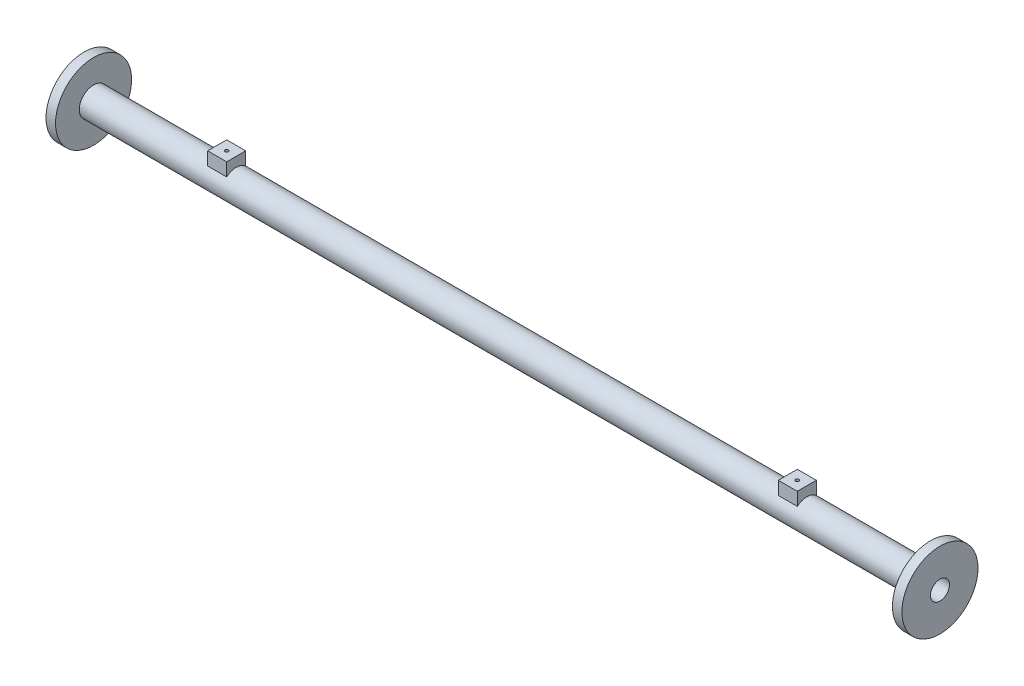
ISO-10303-21;
HEADER;
FILE_DESCRIPTION(('STEP AP214'),'2;1');
FILE_NAME('part.step','',(''),(''),'','','');
FILE_SCHEMA(('AUTOMOTIVE_DESIGN { 1 0 10303 214 1 1 1 1 }'));
ENDSEC;
DATA;
#1=APPLICATION_CONTEXT('core data for automotive mechanical design processes');
#2=APPLICATION_PROTOCOL_DEFINITION('international standard','automotive_design',2000,#1);
#3=PRODUCT_CONTEXT('',#1,'mechanical');
#4=PRODUCT('Part','Part','',(#3));
#5=PRODUCT_RELATED_PRODUCT_CATEGORY('part','',(#4));
#6=PRODUCT_DEFINITION_FORMATION('','',#4);
#7=PRODUCT_DEFINITION_CONTEXT('part definition',#1,'design');
#8=PRODUCT_DEFINITION('design','',#6,#7);
#9=PRODUCT_DEFINITION_SHAPE('','',#8);
#10=(LENGTH_UNIT() NAMED_UNIT(*) SI_UNIT(.MILLI.,.METRE.));
#11=(NAMED_UNIT(*) PLANE_ANGLE_UNIT() SI_UNIT($,.RADIAN.));
#12=(NAMED_UNIT(*) SI_UNIT($,.STERADIAN.) SOLID_ANGLE_UNIT());
#13=UNCERTAINTY_MEASURE_WITH_UNIT(LENGTH_MEASURE(1.E-05),#10,'distance_accuracy_value','');
#14=(GEOMETRIC_REPRESENTATION_CONTEXT(3) GLOBAL_UNCERTAINTY_ASSIGNED_CONTEXT((#13)) GLOBAL_UNIT_ASSIGNED_CONTEXT((#10,
#11,#12)) REPRESENTATION_CONTEXT('',''));
#15=CARTESIAN_POINT('',(0.,0.,0.));
#16=DIRECTION('',(0.,0.,1.));
#17=DIRECTION('',(1.,0.,0.));
#18=AXIS2_PLACEMENT_3D('',#15,#16,#17);
#19=CARTESIAN_POINT('',(571.5,0.,0.));
#20=DIRECTION('',(-1.,0.,0.));
#21=DIRECTION('',(0.,0.,1.));
#22=AXIS2_PLACEMENT_3D('',#19,#20,#21);
#23=CYLINDRICAL_SURFACE('',#22,19.05);
#24=CARTESIAN_POINT('',(368.3,0.,0.));
#25=DIRECTION('',(-1.,0.,0.));
#26=DIRECTION('',(0.,0.,1.));
#27=AXIS2_PLACEMENT_3D('',#24,#25,#26);
#28=CIRCLE('',#27,19.05);
#29=CARTESIAN_POINT('',(368.3,14.1990316571237,-12.7));
#30=VERTEX_POINT('',#29);
#31=CARTESIAN_POINT('',(368.3,14.1990316571237,12.7));
#32=VERTEX_POINT('',#31);
#33=EDGE_CURVE('E152',#30,#32,#28,.F.);
#34=ORIENTED_EDGE('',*,*,#33,.F.);
#35=DIRECTION('',(-1.,0.,0.));
#36=VECTOR('',#35,1.);
#37=CARTESIAN_POINT('',(571.5,14.1990316571237,-12.7));
#38=LINE('',#37,#36);
#39=CARTESIAN_POINT('',(393.7,14.1990316571423,-12.7));
#40=VERTEX_POINT('',#39);
#41=EDGE_CURVE('E139',#40,#30,#38,.T.);
#42=ORIENTED_EDGE('',*,*,#41,.F.);
#43=CARTESIAN_POINT('',(393.7,0.,0.));
#44=DIRECTION('',(1.,0.,0.));
#45=DIRECTION('',(0.,0.,-1.));
#46=AXIS2_PLACEMENT_3D('',#43,#44,#45);
#47=CIRCLE('',#46,19.05);
#48=CARTESIAN_POINT('',(393.7,14.1990316571423,12.7));
#49=VERTEX_POINT('',#48);
#50=EDGE_CURVE('E129',#49,#40,#47,.F.);
#51=ORIENTED_EDGE('',*,*,#50,.F.);
#52=DIRECTION('',(-1.,0.,0.));
#53=VECTOR('',#52,1.);
#54=CARTESIAN_POINT('',(571.5,14.1990316571237,12.7));
#55=LINE('',#54,#53);
#56=EDGE_CURVE('E148',#32,#49,#55,.F.);
#57=ORIENTED_EDGE('',*,*,#56,.F.);
#58=EDGE_LOOP('',(#34,#42,#51,#57));
#59=FACE_BOUND('',#58,.T.);
#60=CARTESIAN_POINT('',(-393.7,0.,0.));
#61=DIRECTION('',(-1.,0.,0.));
#62=DIRECTION('',(0.,0.,1.));
#63=AXIS2_PLACEMENT_3D('',#60,#61,#62);
#64=CIRCLE('',#63,19.05);
#65=CARTESIAN_POINT('',(-393.7,14.1990316571237,-12.7));
#66=VERTEX_POINT('',#65);
#67=CARTESIAN_POINT('',(-393.7,14.1990316571237,12.7));
#68=VERTEX_POINT('',#67);
#69=EDGE_CURVE('E182',#66,#68,#64,.F.);
#70=ORIENTED_EDGE('',*,*,#69,.F.);
#71=DIRECTION('',(-1.,0.,0.));
#72=VECTOR('',#71,1.);
#73=CARTESIAN_POINT('',(571.5,14.1990316571237,-12.7));
#74=LINE('',#73,#72);
#75=CARTESIAN_POINT('',(-368.3,14.1990316571423,-12.7));
#76=VERTEX_POINT('',#75);
#77=EDGE_CURVE('E183',#76,#66,#74,.T.);
#78=ORIENTED_EDGE('',*,*,#77,.F.);
#79=CARTESIAN_POINT('',(-368.3,0.,0.));
#80=DIRECTION('',(1.,0.,0.));
#81=DIRECTION('',(0.,0.,-1.));
#82=AXIS2_PLACEMENT_3D('',#79,#80,#81);
#83=CIRCLE('',#82,19.05);
#84=CARTESIAN_POINT('',(-368.3,14.1990316571423,12.7));
#85=VERTEX_POINT('',#84);
#86=EDGE_CURVE('E185',#85,#76,#83,.F.);
#87=ORIENTED_EDGE('',*,*,#86,.F.);
#88=DIRECTION('',(-1.,0.,0.));
#89=VECTOR('',#88,1.);
#90=CARTESIAN_POINT('',(571.5,14.1990316571237,12.7));
#91=LINE('',#90,#89);
#92=EDGE_CURVE('E179',#68,#85,#91,.F.);
#93=ORIENTED_EDGE('',*,*,#92,.F.);
#94=EDGE_LOOP('',(#70,#78,#87,#93));
#95=FACE_BOUND('',#94,.T.);
#96=CARTESIAN_POINT('',(558.8,0.,0.));
#97=DIRECTION('',(1.,0.,0.));
#98=DIRECTION('',(0.,0.,-1.));
#99=AXIS2_PLACEMENT_3D('',#96,#97,#98);
#100=CIRCLE('',#99,19.05);
#101=CARTESIAN_POINT('',(558.8,0.,-19.05));
#102=VERTEX_POINT('',#101);
#103=EDGE_CURVE('E203',#102,#102,#100,.T.);
#104=ORIENTED_EDGE('',*,*,#103,.F.);
#105=EDGE_LOOP('',(#104));
#106=FACE_BOUND('',#105,.T.);
#107=CARTESIAN_POINT('',(-558.8,0.,0.));
#108=DIRECTION('',(-1.,0.,0.));
#109=DIRECTION('',(0.,0.,1.));
#110=AXIS2_PLACEMENT_3D('',#107,#108,#109);
#111=CIRCLE('',#110,19.05);
#112=CARTESIAN_POINT('',(-558.8,0.,19.05));
#113=VERTEX_POINT('',#112);
#114=EDGE_CURVE('E200',#113,#113,#111,.T.);
#115=ORIENTED_EDGE('',*,*,#114,.F.);
#116=EDGE_LOOP('',(#115));
#117=FACE_BOUND('',#116,.T.);
#118=ADVANCED_FACE('F61',(#59,#95,#106,#117),#23,.T.);
#119=CARTESIAN_POINT('',(571.5,0.,0.));
#120=DIRECTION('',(1.,0.,0.));
#121=DIRECTION('',(0.,0.,-1.));
#122=AXIS2_PLACEMENT_3D('',#119,#120,#121);
#123=PLANE('',#122);
#124=CARTESIAN_POINT('',(571.5,0.,0.));
#125=DIRECTION('',(1.,0.,0.));
#126=DIRECTION('',(0.,0.,-1.));
#127=AXIS2_PLACEMENT_3D('',#124,#125,#126);
#128=CIRCLE('',#127,12.7);
#129=CARTESIAN_POINT('',(571.5,0.,-12.7));
#130=VERTEX_POINT('',#129);
#131=EDGE_CURVE('E212',#130,#130,#128,.T.);
#132=ORIENTED_EDGE('',*,*,#131,.F.);
#133=EDGE_LOOP('',(#132));
#134=FACE_BOUND('',#133,.T.);
#135=CARTESIAN_POINT('',(571.5,0.,0.));
#136=DIRECTION('',(1.,0.,0.));
#137=DIRECTION('',(0.,0.,-1.));
#138=AXIS2_PLACEMENT_3D('',#135,#136,#137);
#139=CIRCLE('',#138,50.8);
#140=CARTESIAN_POINT('',(571.5,0.,-50.8));
#141=VERTEX_POINT('',#140);
#142=EDGE_CURVE('E197',#141,#141,#139,.T.);
#143=ORIENTED_EDGE('',*,*,#142,.T.);
#144=EDGE_LOOP('',(#143));
#145=FACE_BOUND('',#144,.T.);
#146=ADVANCED_FACE('F262',(#134,#145),#123,.T.);
#147=CARTESIAN_POINT('',(-571.5,0.,0.));
#148=DIRECTION('',(1.,0.,0.));
#149=DIRECTION('',(0.,0.,-1.));
#150=AXIS2_PLACEMENT_3D('',#147,#148,#149);
#151=PLANE('',#150);
#152=CARTESIAN_POINT('',(-571.5,0.,0.));
#153=DIRECTION('',(1.,0.,0.));
#154=DIRECTION('',(0.,0.,-1.));
#155=AXIS2_PLACEMENT_3D('',#152,#153,#154);
#156=CIRCLE('',#155,12.7);
#157=CARTESIAN_POINT('',(-571.5,0.,-12.7));
#158=VERTEX_POINT('',#157);
#159=EDGE_CURVE('E207',#158,#158,#156,.T.);
#160=ORIENTED_EDGE('',*,*,#159,.T.);
#161=EDGE_LOOP('',(#160));
#162=FACE_BOUND('',#161,.T.);
#163=CARTESIAN_POINT('',(-571.5,0.,0.));
#164=DIRECTION('',(-1.,0.,0.));
#165=DIRECTION('',(0.,0.,1.));
#166=AXIS2_PLACEMENT_3D('',#163,#164,#165);
#167=CIRCLE('',#166,50.8);
#168=CARTESIAN_POINT('',(-571.5,0.,50.8));
#169=VERTEX_POINT('',#168);
#170=EDGE_CURVE('E172',#169,#169,#167,.T.);
#171=ORIENTED_EDGE('',*,*,#170,.T.);
#172=EDGE_LOOP('',(#171));
#173=FACE_BOUND('',#172,.T.);
#174=ADVANCED_FACE('F260',(#162,#173),#151,.F.);
#175=CARTESIAN_POINT('',(571.5,0.,0.));
#176=DIRECTION('',(-1.,0.,0.));
#177=DIRECTION('',(0.,0.,1.));
#178=AXIS2_PLACEMENT_3D('',#175,#176,#177);
#179=CYLINDRICAL_SURFACE('',#178,12.7);
#180=ORIENTED_EDGE('',*,*,#159,.F.);
#181=EDGE_LOOP('',(#180));
#182=FACE_BOUND('',#181,.T.);
#183=ORIENTED_EDGE('',*,*,#131,.T.);
#184=EDGE_LOOP('',(#183));
#185=FACE_BOUND('',#184,.T.);
#186=ADVANCED_FACE('F253',(#182,#185),#179,.F.);
#187=CARTESIAN_POINT('',(558.8,0.,0.));
#188=DIRECTION('',(1.,0.,0.));
#189=DIRECTION('',(0.,0.,-1.));
#190=AXIS2_PLACEMENT_3D('',#187,#188,#189);
#191=PLANE('',#190);
#192=CARTESIAN_POINT('',(558.8,0.,0.));
#193=DIRECTION('',(1.,0.,0.));
#194=DIRECTION('',(0.,0.,-1.));
#195=AXIS2_PLACEMENT_3D('',#192,#193,#194);
#196=CIRCLE('',#195,50.8);
#197=CARTESIAN_POINT('',(558.8,0.,-50.8));
#198=VERTEX_POINT('',#197);
#199=EDGE_CURVE('E204',#198,#198,#196,.T.);
#200=ORIENTED_EDGE('',*,*,#199,.F.);
#201=EDGE_LOOP('',(#200));
#202=FACE_BOUND('',#201,.T.);
#203=ORIENTED_EDGE('',*,*,#103,.T.);
#204=EDGE_LOOP('',(#203));
#205=FACE_BOUND('',#204,.T.);
#206=ADVANCED_FACE('F250',(#202,#205),#191,.F.);
#207=CARTESIAN_POINT('',(558.8,0.,0.));
#208=DIRECTION('',(1.,0.,0.));
#209=DIRECTION('',(0.,0.,-1.));
#210=AXIS2_PLACEMENT_3D('',#207,#208,#209);
#211=CYLINDRICAL_SURFACE('',#210,50.8);
#212=ORIENTED_EDGE('',*,*,#199,.T.);
#213=EDGE_LOOP('',(#212));
#214=FACE_BOUND('',#213,.T.);
#215=ORIENTED_EDGE('',*,*,#142,.F.);
#216=EDGE_LOOP('',(#215));
#217=FACE_BOUND('',#216,.T.);
#218=ADVANCED_FACE('F245',(#214,#217),#211,.T.);
#219=CARTESIAN_POINT('',(-558.8,0.,0.));
#220=DIRECTION('',(-1.,0.,0.));
#221=DIRECTION('',(0.,0.,1.));
#222=AXIS2_PLACEMENT_3D('',#219,#220,#221);
#223=PLANE('',#222);
#224=CARTESIAN_POINT('',(-558.8,0.,0.));
#225=DIRECTION('',(-1.,0.,0.));
#226=DIRECTION('',(0.,0.,1.));
#227=AXIS2_PLACEMENT_3D('',#224,#225,#226);
#228=CIRCLE('',#227,50.8);
#229=CARTESIAN_POINT('',(-558.8,0.,50.8));
#230=VERTEX_POINT('',#229);
#231=EDGE_CURVE('E194',#230,#230,#228,.T.);
#232=ORIENTED_EDGE('',*,*,#231,.F.);
#233=EDGE_LOOP('',(#232));
#234=FACE_BOUND('',#233,.T.);
#235=ORIENTED_EDGE('',*,*,#114,.T.);
#236=EDGE_LOOP('',(#235));
#237=FACE_BOUND('',#236,.T.);
#238=ADVANCED_FACE('F242',(#234,#237),#223,.F.);
#239=CARTESIAN_POINT('',(-558.8,0.,0.));
#240=DIRECTION('',(-1.,0.,0.));
#241=DIRECTION('',(0.,0.,1.));
#242=AXIS2_PLACEMENT_3D('',#239,#240,#241);
#243=CYLINDRICAL_SURFACE('',#242,50.8);
#244=ORIENTED_EDGE('',*,*,#231,.T.);
#245=EDGE_LOOP('',(#244));
#246=FACE_BOUND('',#245,.T.);
#247=ORIENTED_EDGE('',*,*,#170,.F.);
#248=EDGE_LOOP('',(#247));
#249=FACE_BOUND('',#248,.T.);
#250=ADVANCED_FACE('F241',(#246,#249),#243,.T.);
#251=CARTESIAN_POINT('',(-393.7,-500000.,-12.7));
#252=DIRECTION('',(0.,0.,-1.));
#253=DIRECTION('',(-1.,0.,0.));
#254=AXIS2_PLACEMENT_3D('',#251,#252,#253);
#255=PLANE('',#254);
#256=DIRECTION('',(0.,1.,0.));
#257=VECTOR('',#256,1.);
#258=CARTESIAN_POINT('',(-368.3,-500000.,-12.7));
#259=LINE('',#258,#257);
#260=CARTESIAN_POINT('',(-368.3,31.75,-12.7));
#261=VERTEX_POINT('',#260);
#262=EDGE_CURVE('E181',#76,#261,#259,.T.);
#263=ORIENTED_EDGE('',*,*,#262,.F.);
#264=ORIENTED_EDGE('',*,*,#77,.T.);
#265=DIRECTION('',(0.,1.,0.));
#266=VECTOR('',#265,1.);
#267=CARTESIAN_POINT('',(-393.7,-500000.,-12.7));
#268=LINE('',#267,#266);
#269=CARTESIAN_POINT('',(-393.7,31.75,-12.7));
#270=VERTEX_POINT('',#269);
#271=EDGE_CURVE('E188',#66,#270,#268,.T.);
#272=ORIENTED_EDGE('',*,*,#271,.T.);
#273=DIRECTION('',(-1.,0.,0.));
#274=VECTOR('',#273,1.);
#275=CARTESIAN_POINT('',(-393.7,31.75,-12.7));
#276=LINE('',#275,#274);
#277=EDGE_CURVE('E165',#261,#270,#276,.T.);
#278=ORIENTED_EDGE('',*,*,#277,.F.);
#279=EDGE_LOOP('',(#263,#264,#272,#278));
#280=FACE_BOUND('',#279,.T.);
#281=ADVANCED_FACE('F228',(#280),#255,.T.);
#282=CARTESIAN_POINT('',(-368.3,31.75,-12.7));
#283=DIRECTION('',(0.,-1.,0.));
#284=DIRECTION('',(0.,0.,-1.));
#285=AXIS2_PLACEMENT_3D('',#282,#283,#284);
#286=PLANE('',#285);
#287=DIRECTION('',(0.,0.,-1.));
#288=VECTOR('',#287,1.);
#289=CARTESIAN_POINT('',(-368.3,31.75,12.7));
#290=LINE('',#289,#288);
#291=CARTESIAN_POINT('',(-368.3,31.75,12.7));
#292=VERTEX_POINT('',#291);
#293=EDGE_CURVE('E169',#292,#261,#290,.T.);
#294=ORIENTED_EDGE('',*,*,#293,.T.);
#295=ORIENTED_EDGE('',*,*,#277,.T.);
#296=DIRECTION('',(0.,0.,1.));
#297=VECTOR('',#296,1.);
#298=CARTESIAN_POINT('',(-393.7,31.75,12.7));
#299=LINE('',#298,#297);
#300=CARTESIAN_POINT('',(-393.7,31.75,12.7));
#301=VERTEX_POINT('',#300);
#302=EDGE_CURVE('E162',#270,#301,#299,.T.);
#303=ORIENTED_EDGE('',*,*,#302,.T.);
#304=DIRECTION('',(1.,0.,0.));
#305=VECTOR('',#304,1.);
#306=CARTESIAN_POINT('',(-393.7,31.75,12.7));
#307=LINE('',#306,#305);
#308=EDGE_CURVE('E166',#301,#292,#307,.T.);
#309=ORIENTED_EDGE('',*,*,#308,.T.);
#310=EDGE_LOOP('',(#294,#295,#303,#309));
#311=FACE_BOUND('',#310,.T.);
#312=CARTESIAN_POINT('',(-381.,31.75,0.));
#313=DIRECTION('',(0.,1.,0.));
#314=DIRECTION('',(0.,0.,1.));
#315=AXIS2_PLACEMENT_3D('',#312,#313,#314);
#316=CIRCLE('',#315,2.28600000000004);
#317=CARTESIAN_POINT('',(-381.,31.75,2.28600000000003));
#318=VERTEX_POINT('',#317);
#319=EDGE_CURVE('E175',#318,#318,#316,.T.);
#320=ORIENTED_EDGE('',*,*,#319,.F.);
#321=EDGE_LOOP('',(#320));
#322=FACE_BOUND('',#321,.T.);
#323=ADVANCED_FACE('F226',(#311,#322),#286,.F.);
#324=CARTESIAN_POINT('',(-381.,-500000.,0.));
#325=DIRECTION('',(0.,1.,0.));
#326=DIRECTION('',(0.,0.,1.));
#327=AXIS2_PLACEMENT_3D('',#324,#325,#326);
#328=CYLINDRICAL_SURFACE('',#327,2.28600000000004);
#329=ORIENTED_EDGE('',*,*,#319,.T.);
#330=EDGE_LOOP('',(#329));
#331=FACE_BOUND('',#330,.T.);
#332=CARTESIAN_POINT('',(-381.,18.9123426364901,2.28600000000003));
#333=CARTESIAN_POINT('',(-381.127908665594,18.912344408558,2.28599453777584));
#334=CARTESIAN_POINT('',(-381.255898284354,18.9136542560225,2.27522847083813));
#335=CARTESIAN_POINT('',(-381.508318474388,18.9187504146085,2.23244906856363));
#336=CARTESIAN_POINT('',(-381.632745137113,18.9225393442396,2.20041326672094));
#337=CARTESIAN_POINT('',(-381.874348064994,18.93215846091,2.11604987977415));
#338=CARTESIAN_POINT('',(-381.991529076984,18.9379872945147,2.06373574645828));
#339=CARTESIAN_POINT('',(-382.215425922283,18.9510278203983,1.94032889219112));
#340=CARTESIAN_POINT('',(-382.322143602775,18.9582392679255,1.86923949401545));
#341=CARTESIAN_POINT('',(-382.522658705966,18.9732742241852,1.709906236747));
#342=CARTESIAN_POINT('',(-382.616394248294,18.9811004032235,1.62158474704995));
#343=CARTESIAN_POINT('',(-382.78775008324,18.9964589528062,1.43046134863375));
#344=CARTESIAN_POINT('',(-382.865369588488,19.0039913089809,1.32765873283124));
#345=CARTESIAN_POINT('',(-383.002510498097,19.0179406805588,1.1101041311726));
#346=CARTESIAN_POINT('',(-383.061976126794,19.0243542332071,0.995316744832931));
#347=CARTESIAN_POINT('',(-383.160764126813,19.0353140687346,0.757295234661844));
#348=CARTESIAN_POINT('',(-383.200087189668,19.0398604157173,0.634061400977162));
#349=CARTESIAN_POINT('',(-383.257289559151,19.0465547941289,0.383276747022599));
#350=CARTESIAN_POINT('',(-383.275271537926,19.0487143051679,0.255749656935018));
#351=CARTESIAN_POINT('',(-383.289599382675,19.0504308626969,-0.000529206461489216));
#352=CARTESIAN_POINT('',(-383.285946036805,19.049988003989,-0.12928093498732));
#353=CARTESIAN_POINT('',(-383.257189449149,19.0465590309053,-0.383656078648403));
#354=CARTESIAN_POINT('',(-383.232196624011,19.0435860085866,-0.509292177427021));
#355=CARTESIAN_POINT('',(-383.161643008392,19.0354455273854,-0.754573830009514));
#356=CARTESIAN_POINT('',(-383.116081853034,19.0302780295735,-0.874219277498499));
#357=CARTESIAN_POINT('',(-383.005566680573,19.018306736327,-1.10446651592368));
#358=CARTESIAN_POINT('',(-382.940564646163,19.0114988975783,-1.21504504052388));
#359=CARTESIAN_POINT('',(-382.793047798995,18.9970090696977,-1.42376569719151));
#360=CARTESIAN_POINT('',(-382.710532245871,18.9893270436166,-1.52190730322041));
#361=CARTESIAN_POINT('',(-382.52971168565,18.9738919539915,-1.70361651495766));
#362=CARTESIAN_POINT('',(-382.431310486593,18.9661387477997,-1.78708841625327));
#363=CARTESIAN_POINT('',(-382.221842986576,18.9514830047109,-1.93634556970772));
#364=CARTESIAN_POINT('',(-382.110776651317,18.9445804701177,-2.00213077396664));
#365=CARTESIAN_POINT('',(-381.879048922508,18.9324075546074,-2.11415130909295));
#366=CARTESIAN_POINT('',(-381.758383973762,18.927137782014,-2.16037935582126));
#367=CARTESIAN_POINT('',(-381.51092682206,18.9188390969638,-2.23189045644675));
#368=CARTESIAN_POINT('',(-381.384134890769,18.9158100852509,-2.2571744380822));
#369=CARTESIAN_POINT('',(-381.128867080561,18.9123538451915,-2.28595373678674));
#370=CARTESIAN_POINT('',(-381.000406575859,18.9119105551203,-2.28958356614332));
#371=CARTESIAN_POINT('',(-380.744708068998,18.9136334935473,-2.27530607718373));
#372=CARTESIAN_POINT('',(-380.617470042922,18.9157996708879,-2.25739918108736));
#373=CARTESIAN_POINT('',(-380.368229012898,18.9224828261534,-2.20066965459821));
#374=CARTESIAN_POINT('',(-380.246211047731,18.9269925194845,-2.16191182424193));
#375=CARTESIAN_POINT('',(-380.010406386372,18.9378486764175,-2.06464720515982));
#376=CARTESIAN_POINT('',(-379.896619957969,18.9441951997416,-2.00613977429065));
#377=CARTESIAN_POINT('',(-379.679898783229,18.9580484932734,-1.87070468673871));
#378=CARTESIAN_POINT('',(-379.577019645396,18.965560769071,-1.79368861841807));
#379=CARTESIAN_POINT('',(-379.385600043885,18.9808816881761,-1.62354781591573));
#380=CARTESIAN_POINT('',(-379.297060093665,18.988690342084,-1.53042250514041));
#381=CARTESIAN_POINT('',(-379.136361552607,19.0037733420022,-1.33011997577282));
#382=CARTESIAN_POINT('',(-379.064291212158,19.0110446745095,-1.22287169655641));
#383=CARTESIAN_POINT('',(-378.939187604491,19.0241889592544,-0.997714359210885));
#384=CARTESIAN_POINT('',(-378.886153979511,19.0300619377709,-0.879805501481076));
#385=CARTESIAN_POINT('',(-378.800775794285,19.0397343688052,-0.636970464476659));
#386=CARTESIAN_POINT('',(-378.768379733848,19.0435389793403,-0.512062606033174));
#387=CARTESIAN_POINT('',(-378.72502862139,19.0486673659754,-0.258531805763517));
#388=CARTESIAN_POINT('',(-378.71407268208,19.0499912447393,-0.129909017901489));
#389=CARTESIAN_POINT('',(-378.713928490786,19.0500086143069,0.126537724766812));
#390=CARTESIAN_POINT('',(-378.724603964047,19.048718572432,0.254361623350066));
#391=CARTESIAN_POINT('',(-378.767131558636,19.0436857176378,0.506384985294744));
#392=CARTESIAN_POINT('',(-378.798983673022,19.0399429055226,0.630584449844204));
#393=CARTESIAN_POINT('',(-378.88291864753,19.0304233070851,0.871819101659545));
#394=CARTESIAN_POINT('',(-378.934995517714,19.0246471230312,0.988856398266019));
#395=CARTESIAN_POINT('',(-379.057887605023,19.0117013041689,1.21255186282034));
#396=CARTESIAN_POINT('',(-379.128702973795,19.0045316580836,1.31920994676185));
#397=CARTESIAN_POINT('',(-379.287567825689,18.9895459194044,1.51981622699746));
#398=CARTESIAN_POINT('',(-379.375718784758,18.9817261850178,1.61368379412216));
#399=CARTESIAN_POINT('',(-379.56654315431,18.9663512110822,1.78534870802859));
#400=CARTESIAN_POINT('',(-379.66922000815,18.9587960347779,1.86314223367576));
#401=CARTESIAN_POINT('',(-379.886598317362,18.9447768836122,2.00068490943307));
#402=CARTESIAN_POINT('',(-380.001341338144,18.938316895173,2.06036873828637));
#403=CARTESIAN_POINT('',(-380.239232728358,18.9272663651129,2.15953700037698));
#404=CARTESIAN_POINT('',(-380.362371713052,18.9226737749139,2.19904358076645));
#405=CARTESIAN_POINT('',(-380.571801368799,18.9170025954451,2.24719141676113));
#406=CARTESIAN_POINT('',(-380.656766816994,18.915263716976,2.26172393685753));
#407=CARTESIAN_POINT('',(-380.827809284286,18.912933144869,2.28113003445064));
#408=CARTESIAN_POINT('',(-380.913886295845,18.9123414434565,2.28600367740809));
#409=CARTESIAN_POINT('',(-381.,18.9123426364901,2.28600000000003));
#410=B_SPLINE_CURVE_WITH_KNOTS('',3,(#332,#333,#334,#335,#336,#337,#338,#339,#340,#341,#342,
#343,#344,#345,#346,#347,#348,#349,#350,#351,#352,#353,#354,#355,#356,#357,#358,#359,#360,#361,
#362,#363,#364,#365,#366,#367,#368,#369,#370,#371,#372,#373,#374,#375,#376,#377,#378,#379,#380,
#381,#382,#383,#384,#385,#386,#387,#388,#389,#390,#391,#392,#393,#394,#395,#396,#397,#398,#399,
#400,#401,#402,#403,#404,#405,#406,#407,#408,#409),.UNSPECIFIED.,.T.,.F.,(4,2,2,2,2,2,2,2,2,2,2,
2,2,2,2,2,2,2,2,2,2,2,2,2,2,2,2,2,2,2,2,2,2,2,2,2,2,2,4),(0.,0.383411435283527,
0.767228500844937,1.15079139290428,1.53428644888266,1.91955079632446,2.30483396195017,
2.6912892205823,3.07773121060782,3.46230638920708,3.84686755815676,4.22945087174958,
4.6120409725672,4.99558395362754,5.37914315181544,5.76511860241576,6.15109509832208,
6.53721522637595,6.92331824993859,7.30702034215798,7.69071491215775,8.07322387614293,
8.45574527831614,8.84013154738732,9.22453157753659,9.61094544125043,9.99735204260302,
10.3827905654187,10.7682131367072,11.151215151532,11.5342170408129,11.9171055833359,
12.2999972245901,12.685200721444,13.0704956841094,13.4571643136922,13.8434076071194,
14.1015386924651,14.3596680283828),.UNSPECIFIED.);
#411=CARTESIAN_POINT('',(-381.,18.9123426364901,2.28600000000003));
#412=VERTEX_POINT('',#411);
#413=EDGE_CURVE('E72',#412,#412,#410,.T.);
#414=ORIENTED_EDGE('',*,*,#413,.T.);
#415=EDGE_LOOP('',(#414));
#416=FACE_BOUND('',#415,.T.);
#417=ADVANCED_FACE('F220',(#331,#416),#328,.F.);
#418=CARTESIAN_POINT('',(-368.3,-500000.,12.7));
#419=DIRECTION('',(1.,0.,0.));
#420=DIRECTION('',(0.,0.,-1.));
#421=AXIS2_PLACEMENT_3D('',#418,#419,#420);
#422=PLANE('',#421);
#423=DIRECTION('',(0.,1.,0.));
#424=VECTOR('',#423,1.);
#425=CARTESIAN_POINT('',(-368.3,-500000.,12.7));
#426=LINE('',#425,#424);
#427=EDGE_CURVE('E178',#85,#292,#426,.T.);
#428=ORIENTED_EDGE('',*,*,#427,.F.);
#429=ORIENTED_EDGE('',*,*,#86,.T.);
#430=ORIENTED_EDGE('',*,*,#262,.T.);
#431=ORIENTED_EDGE('',*,*,#293,.F.);
#432=EDGE_LOOP('',(#428,#429,#430,#431));
#433=FACE_BOUND('',#432,.T.);
#434=ADVANCED_FACE('F225',(#433),#422,.T.);
#435=CARTESIAN_POINT('',(-393.7,-500000.,12.7));
#436=DIRECTION('',(-1.,0.,0.));
#437=DIRECTION('',(0.,0.,1.));
#438=AXIS2_PLACEMENT_3D('',#435,#436,#437);
#439=PLANE('',#438);
#440=ORIENTED_EDGE('',*,*,#271,.F.);
#441=ORIENTED_EDGE('',*,*,#69,.T.);
#442=DIRECTION('',(0.,1.,0.));
#443=VECTOR('',#442,1.);
#444=CARTESIAN_POINT('',(-393.7,-500000.,12.7));
#445=LINE('',#444,#443);
#446=EDGE_CURVE('E87',#68,#301,#445,.T.);
#447=ORIENTED_EDGE('',*,*,#446,.T.);
#448=ORIENTED_EDGE('',*,*,#302,.F.);
#449=EDGE_LOOP('',(#440,#441,#447,#448));
#450=FACE_BOUND('',#449,.T.);
#451=ADVANCED_FACE('F232',(#450),#439,.T.);
#452=CARTESIAN_POINT('',(-393.7,-500000.,12.7));
#453=DIRECTION('',(0.,0.,1.));
#454=DIRECTION('',(1.,0.,0.));
#455=AXIS2_PLACEMENT_3D('',#452,#453,#454);
#456=PLANE('',#455);
#457=ORIENTED_EDGE('',*,*,#446,.F.);
#458=ORIENTED_EDGE('',*,*,#92,.T.);
#459=ORIENTED_EDGE('',*,*,#427,.T.);
#460=ORIENTED_EDGE('',*,*,#308,.F.);
#461=EDGE_LOOP('',(#457,#458,#459,#460));
#462=FACE_BOUND('',#461,.T.);
#463=ADVANCED_FACE('F236',(#462),#456,.T.);
#464=ORIENTED_EDGE('',*,*,#413,.F.);
#465=EDGE_LOOP('',(#464));
#466=FACE_BOUND('',#465,.T.);
#467=ADVANCED_FACE('F240',(#466),#23,.T.);
#468=CARTESIAN_POINT('',(393.7,-500000.,-12.7));
#469=DIRECTION('',(0.,0.,-1.));
#470=DIRECTION('',(-1.,0.,0.));
#471=AXIS2_PLACEMENT_3D('',#468,#469,#470);
#472=PLANE('',#471);
#473=DIRECTION('',(0.,1.,0.));
#474=VECTOR('',#473,1.);
#475=CARTESIAN_POINT('',(393.7,-500000.,-12.7));
#476=LINE('',#475,#474);
#477=CARTESIAN_POINT('',(393.7,31.75,-12.7));
#478=VERTEX_POINT('',#477);
#479=EDGE_CURVE('E133',#40,#478,#476,.T.);
#480=ORIENTED_EDGE('',*,*,#479,.F.);
#481=ORIENTED_EDGE('',*,*,#41,.T.);
#482=DIRECTION('',(0.,1.,0.));
#483=VECTOR('',#482,1.);
#484=CARTESIAN_POINT('',(368.3,-500000.,-12.7));
#485=LINE('',#484,#483);
#486=CARTESIAN_POINT('',(368.3,31.75,-12.7));
#487=VERTEX_POINT('',#486);
#488=EDGE_CURVE('E147',#30,#487,#485,.T.);
#489=ORIENTED_EDGE('',*,*,#488,.T.);
#490=DIRECTION('',(-1.,0.,0.));
#491=VECTOR('',#490,1.);
#492=CARTESIAN_POINT('',(393.7,31.75,-12.7));
#493=LINE('',#492,#491);
#494=EDGE_CURVE('E145',#478,#487,#493,.T.);
#495=ORIENTED_EDGE('',*,*,#494,.F.);
#496=EDGE_LOOP('',(#480,#481,#489,#495));
#497=FACE_BOUND('',#496,.T.);
#498=ADVANCED_FACE('F142',(#497),#472,.T.);
#499=CARTESIAN_POINT('',(393.7,31.75,-12.7));
#500=DIRECTION('',(0.,1.,0.));
#501=DIRECTION('',(0.,0.,1.));
#502=AXIS2_PLACEMENT_3D('',#499,#500,#501);
#503=PLANE('',#502);
#504=CARTESIAN_POINT('',(381.,31.75,0.));
#505=DIRECTION('',(0.,1.,0.));
#506=DIRECTION('',(0.,0.,-1.));
#507=AXIS2_PLACEMENT_3D('',#504,#505,#506);
#508=CIRCLE('',#507,2.28600000000004);
#509=CARTESIAN_POINT('',(381.,31.75,-2.28600000000004));
#510=VERTEX_POINT('',#509);
#511=EDGE_CURVE('E159',#510,#510,#508,.T.);
#512=ORIENTED_EDGE('',*,*,#511,.F.);
#513=EDGE_LOOP('',(#512));
#514=FACE_BOUND('',#513,.T.);
#515=DIRECTION('',(0.,0.,-1.));
#516=VECTOR('',#515,1.);
#517=CARTESIAN_POINT('',(393.7,31.75,12.7));
#518=LINE('',#517,#516);
#519=CARTESIAN_POINT('',(393.7,31.75,12.7));
#520=VERTEX_POINT('',#519);
#521=EDGE_CURVE('E193',#520,#478,#518,.T.);
#522=ORIENTED_EDGE('',*,*,#521,.T.);
#523=ORIENTED_EDGE('',*,*,#494,.T.);
#524=DIRECTION('',(0.,0.,1.));
#525=VECTOR('',#524,1.);
#526=CARTESIAN_POINT('',(368.3,31.75,12.7));
#527=LINE('',#526,#525);
#528=CARTESIAN_POINT('',(368.3,31.75,12.7));
#529=VERTEX_POINT('',#528);
#530=EDGE_CURVE('E336',#487,#529,#527,.T.);
#531=ORIENTED_EDGE('',*,*,#530,.T.);
#532=DIRECTION('',(1.,0.,0.));
#533=VECTOR('',#532,1.);
#534=CARTESIAN_POINT('',(393.7,31.75,12.7));
#535=LINE('',#534,#533);
#536=EDGE_CURVE('E334',#529,#520,#535,.T.);
#537=ORIENTED_EDGE('',*,*,#536,.T.);
#538=EDGE_LOOP('',(#522,#523,#531,#537));
#539=FACE_BOUND('',#538,.T.);
#540=ADVANCED_FACE('F282',(#514,#539),#503,.T.);
#541=CARTESIAN_POINT('',(393.7,-500000.,12.7));
#542=DIRECTION('',(1.,0.,0.));
#543=DIRECTION('',(0.,0.,-1.));
#544=AXIS2_PLACEMENT_3D('',#541,#542,#543);
#545=PLANE('',#544);
#546=DIRECTION('',(0.,1.,0.));
#547=VECTOR('',#546,1.);
#548=CARTESIAN_POINT('',(393.7,-500000.,12.7));
#549=LINE('',#548,#547);
#550=EDGE_CURVE('E135',#49,#520,#549,.T.);
#551=ORIENTED_EDGE('',*,*,#550,.F.);
#552=ORIENTED_EDGE('',*,*,#50,.T.);
#553=ORIENTED_EDGE('',*,*,#479,.T.);
#554=ORIENTED_EDGE('',*,*,#521,.F.);
#555=EDGE_LOOP('',(#551,#552,#553,#554));
#556=FACE_BOUND('',#555,.T.);
#557=ADVANCED_FACE('F131',(#556),#545,.T.);
#558=CARTESIAN_POINT('',(368.3,-500000.,12.7));
#559=DIRECTION('',(-1.,0.,0.));
#560=DIRECTION('',(0.,0.,1.));
#561=AXIS2_PLACEMENT_3D('',#558,#559,#560);
#562=PLANE('',#561);
#563=ORIENTED_EDGE('',*,*,#488,.F.);
#564=ORIENTED_EDGE('',*,*,#33,.T.);
#565=DIRECTION('',(0.,1.,0.));
#566=VECTOR('',#565,1.);
#567=CARTESIAN_POINT('',(368.3,-500000.,12.7));
#568=LINE('',#567,#566);
#569=EDGE_CURVE('E79',#32,#529,#568,.T.);
#570=ORIENTED_EDGE('',*,*,#569,.T.);
#571=ORIENTED_EDGE('',*,*,#530,.F.);
#572=EDGE_LOOP('',(#563,#564,#570,#571));
#573=FACE_BOUND('',#572,.T.);
#574=ADVANCED_FACE('F319',(#573),#562,.T.);
#575=CARTESIAN_POINT('',(393.7,-500000.,12.7));
#576=DIRECTION('',(0.,0.,1.));
#577=DIRECTION('',(1.,0.,0.));
#578=AXIS2_PLACEMENT_3D('',#575,#576,#577);
#579=PLANE('',#578);
#580=ORIENTED_EDGE('',*,*,#569,.F.);
#581=ORIENTED_EDGE('',*,*,#56,.T.);
#582=ORIENTED_EDGE('',*,*,#550,.T.);
#583=ORIENTED_EDGE('',*,*,#536,.F.);
#584=EDGE_LOOP('',(#580,#581,#582,#583));
#585=FACE_BOUND('',#584,.T.);
#586=ADVANCED_FACE('F286',(#585),#579,.T.);
#587=CARTESIAN_POINT('',(381.,-500000.,0.));
#588=DIRECTION('',(0.,1.,0.));
#589=DIRECTION('',(0.,0.,1.));
#590=AXIS2_PLACEMENT_3D('',#587,#588,#589);
#591=CYLINDRICAL_SURFACE('',#590,2.28600000000004);
#592=ORIENTED_EDGE('',*,*,#511,.T.);
#593=EDGE_LOOP('',(#592));
#594=FACE_BOUND('',#593,.T.);
#595=CARTESIAN_POINT('',(381.,18.9123426364901,2.28600000000003));
#596=CARTESIAN_POINT('',(380.872091334406,18.912344408558,2.28599453777584));
#597=CARTESIAN_POINT('',(380.744101715646,18.9136542560225,2.27522847083813));
#598=CARTESIAN_POINT('',(380.491681525612,18.9187504146085,2.23244906856363));
#599=CARTESIAN_POINT('',(380.367254862887,18.9225393442396,2.20041326672095));
#600=CARTESIAN_POINT('',(380.125651935006,18.93215846091,2.11604987977415));
#601=CARTESIAN_POINT('',(380.008470923016,18.9379872945147,2.06373574645829));
#602=CARTESIAN_POINT('',(379.784574077717,18.9510278203983,1.94032889219114));
#603=CARTESIAN_POINT('',(379.677856397225,18.9582392679255,1.86923949401546));
#604=CARTESIAN_POINT('',(379.477341294034,18.9732742241852,1.70990623674701));
#605=CARTESIAN_POINT('',(379.383605751707,18.9811004032235,1.62158474704995));
#606=CARTESIAN_POINT('',(379.21224991676,18.9964589528062,1.43046134863375));
#607=CARTESIAN_POINT('',(379.134630411512,19.0039913089809,1.32765873283125));
#608=CARTESIAN_POINT('',(378.997489501903,19.0179406805588,1.11010413117259));
#609=CARTESIAN_POINT('',(378.938023873206,19.0243542332071,0.995316744832904));
#610=CARTESIAN_POINT('',(378.839235873187,19.0353140687346,0.757295234661815));
#611=CARTESIAN_POINT('',(378.799912810332,19.0398604157173,0.634061400977148));
#612=CARTESIAN_POINT('',(378.742710440849,19.0465547941289,0.383276747022602));
#613=CARTESIAN_POINT('',(378.724728462074,19.0487143051679,0.25574965693502));
#614=CARTESIAN_POINT('',(378.710400617325,19.0504308626969,-0.000529206461487563));
#615=CARTESIAN_POINT('',(378.714053963195,19.049988003989,-0.129280934987319));
#616=CARTESIAN_POINT('',(378.742810550851,19.0465590309053,-0.383656078648403));
#617=CARTESIAN_POINT('',(378.767803375989,19.0435860085866,-0.509292177427021));
#618=CARTESIAN_POINT('',(378.838356991608,19.0354455273854,-0.754573830009514));
#619=CARTESIAN_POINT('',(378.883918146966,19.0302780295735,-0.874219277498499));
#620=CARTESIAN_POINT('',(378.994433319427,19.018306736327,-1.10446651592368));
#621=CARTESIAN_POINT('',(379.059435353837,19.0114988975783,-1.21504504052388));
#622=CARTESIAN_POINT('',(379.206952201005,18.9970090696977,-1.42376569719151));
#623=CARTESIAN_POINT('',(379.289467754129,18.9893270436166,-1.52190730322041));
#624=CARTESIAN_POINT('',(379.47028831435,18.9738919539915,-1.70361651495766));
#625=CARTESIAN_POINT('',(379.568689513407,18.9661387477997,-1.78708841625327));
#626=CARTESIAN_POINT('',(379.778157013424,18.9514830047109,-1.93634556970772));
#627=CARTESIAN_POINT('',(379.889223348683,18.9445804701177,-2.00213077396664));
#628=CARTESIAN_POINT('',(380.120951077492,18.9324075546074,-2.11415130909295));
#629=CARTESIAN_POINT('',(380.241616026238,18.927137782014,-2.16037935582126));
#630=CARTESIAN_POINT('',(380.48907317794,18.9188390969638,-2.23189045644675));
#631=CARTESIAN_POINT('',(380.615865109231,18.9158100852509,-2.2571744380822));
#632=CARTESIAN_POINT('',(380.871132919439,18.9123538451915,-2.28595373678674));
#633=CARTESIAN_POINT('',(380.999593424141,18.9119105551203,-2.28958356614332));
#634=CARTESIAN_POINT('',(381.255291931002,18.9136334935473,-2.27530607718373));
#635=CARTESIAN_POINT('',(381.382529957078,18.9157996708879,-2.25739918108736));
#636=CARTESIAN_POINT('',(381.631770987102,18.9224828261534,-2.20066965459821));
#637=CARTESIAN_POINT('',(381.753788952269,18.9269925194845,-2.16191182424193));
#638=CARTESIAN_POINT('',(381.989593613628,18.9378486764175,-2.06464720515982));
#639=CARTESIAN_POINT('',(382.103380042031,18.9441951997416,-2.00613977429065));
#640=CARTESIAN_POINT('',(382.320101216771,18.9580484932734,-1.87070468673871));
#641=CARTESIAN_POINT('',(382.422980354604,18.965560769071,-1.79368861841807));
#642=CARTESIAN_POINT('',(382.614399956115,18.9808816881761,-1.62354781591573));
#643=CARTESIAN_POINT('',(382.702939906335,18.988690342084,-1.53042250514041));
#644=CARTESIAN_POINT('',(382.863638447393,19.0037733420022,-1.33011997577282));
#645=CARTESIAN_POINT('',(382.935708787842,19.0110446745095,-1.22287169655641));
#646=CARTESIAN_POINT('',(383.060812395509,19.0241889592544,-0.997714359210885));
#647=CARTESIAN_POINT('',(383.113846020489,19.0300619377709,-0.879805501481076));
#648=CARTESIAN_POINT('',(383.199224205715,19.0397343688052,-0.636970464476659));
#649=CARTESIAN_POINT('',(383.231620266152,19.0435389793403,-0.512062606033174));
#650=CARTESIAN_POINT('',(383.27497137861,19.0486673659754,-0.258531805763517));
#651=CARTESIAN_POINT('',(383.28592731792,19.0499912447393,-0.129909017901489));
#652=CARTESIAN_POINT('',(383.286071509214,19.0500086143069,0.126537724766816));
#653=CARTESIAN_POINT('',(383.275396035953,19.048718572432,0.254361623350073));
#654=CARTESIAN_POINT('',(383.232868441364,19.0436857176378,0.50638498529475));
#655=CARTESIAN_POINT('',(383.201016326978,19.0399429055226,0.630584449844207));
#656=CARTESIAN_POINT('',(383.11708135247,19.0304233070851,0.871819101659545));
#657=CARTESIAN_POINT('',(383.065004482286,19.0246471230312,0.988856398266019));
#658=CARTESIAN_POINT('',(382.942112394977,19.0117013041689,1.21255186282034));
#659=CARTESIAN_POINT('',(382.871297026205,19.0045316580836,1.31920994676185));
#660=CARTESIAN_POINT('',(382.712432174311,18.9895459194044,1.51981622699746));
#661=CARTESIAN_POINT('',(382.624281215242,18.9817261850178,1.61368379412216));
#662=CARTESIAN_POINT('',(382.43345684569,18.9663512110822,1.78534870802859));
#663=CARTESIAN_POINT('',(382.33077999185,18.9587960347779,1.86314223367576));
#664=CARTESIAN_POINT('',(382.113401682638,18.9447768836122,2.00068490943307));
#665=CARTESIAN_POINT('',(381.998658661856,18.938316895173,2.06036873828637));
#666=CARTESIAN_POINT('',(381.760767271642,18.9272663651129,2.15953700037698));
#667=CARTESIAN_POINT('',(381.637628286948,18.9226737749139,2.19904358076645));
#668=CARTESIAN_POINT('',(381.428198631201,18.9170025954451,2.24719141676113));
#669=CARTESIAN_POINT('',(381.343233183006,18.915263716976,2.26172393685753));
#670=CARTESIAN_POINT('',(381.172190715714,18.912933144869,2.28113003445064));
#671=CARTESIAN_POINT('',(381.086113704155,18.9123414434565,2.28600367740809));
#672=CARTESIAN_POINT('',(381.,18.9123426364901,2.28600000000003));
#673=B_SPLINE_CURVE_WITH_KNOTS('',3,(#595,#596,#597,#598,#599,#600,#601,#602,#603,#604,#605,
#606,#607,#608,#609,#610,#611,#612,#613,#614,#615,#616,#617,#618,#619,#620,#621,#622,#623,#624,
#625,#626,#627,#628,#629,#630,#631,#632,#633,#634,#635,#636,#637,#638,#639,#640,#641,#642,#643,
#644,#645,#646,#647,#648,#649,#650,#651,#652,#653,#654,#655,#656,#657,#658,#659,#660,#661,#662,
#663,#664,#665,#666,#667,#668,#669,#670,#671,#672),.UNSPECIFIED.,.T.,.F.,(4,2,2,2,2,2,2,2,2,2,2,
2,2,2,2,2,2,2,2,2,2,2,2,2,2,2,2,2,2,2,2,2,2,2,2,2,2,2,4),(0.,0.383411435283527,
0.767228500844937,1.15079139290422,1.53428644888266,1.91955079632446,2.30483396195016,
2.69128922058234,3.07773121060782,3.46230638920707,3.84686755815676,4.22945087174958,
4.61204097256719,4.99558395362753,5.37914315181544,5.76511860241576,6.15109509832207,
6.53721522637594,6.92331824993858,7.30702034215798,7.69071491215775,8.07322387614293,
8.45574527831613,8.84013154738732,9.22453157753658,9.61094544125043,9.99735204260301,
10.3827905654187,10.7682131367072,11.151215151532,11.5342170408129,11.9171055833359,
12.2999972245901,12.685200721444,13.0704956841094,13.4571643136922,13.8434076071194,
14.1015386924651,14.3596680283828),.UNSPECIFIED.);
#674=CARTESIAN_POINT('',(381.,18.9123426364901,2.28600000000003));
#675=VERTEX_POINT('',#674);
#676=EDGE_CURVE('E12',#675,#675,#673,.T.);
#677=ORIENTED_EDGE('',*,*,#676,.T.);
#678=EDGE_LOOP('',(#677));
#679=FACE_BOUND('',#678,.T.);
#680=ADVANCED_FACE('F275',(#594,#679),#591,.F.);
#681=ORIENTED_EDGE('',*,*,#676,.F.);
#682=EDGE_LOOP('',(#681));
#683=FACE_BOUND('',#682,.T.);
#684=ADVANCED_FACE('F271',(#683),#23,.T.);
#685=CLOSED_SHELL('',(#118,#146,#174,#186,#206,#218,#238,#250,#281,#323,#417,#434,#451,#463,
#467,#498,#540,#557,#574,#586,#680,#684));
#686=MANIFOLD_SOLID_BREP('B2',#685);
#687=ADVANCED_BREP_SHAPE_REPRESENTATION('',(#18,#686),#14);
#688=SHAPE_DEFINITION_REPRESENTATION(#9,#687);
ENDSEC;
END-ISO-10303-21;
